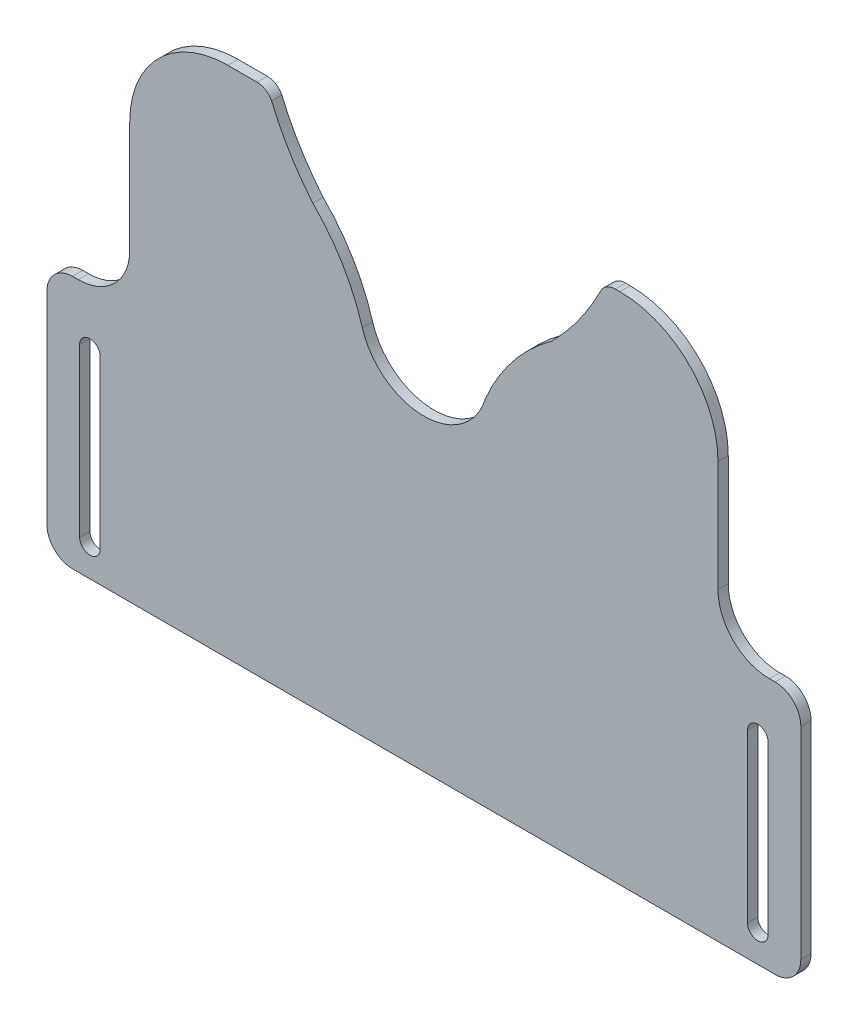
ISO-10303-21;
HEADER;
FILE_DESCRIPTION(('STEP AP214'),'2;1');
FILE_NAME('part.step','',(''),(''),'','','');
FILE_SCHEMA(('AUTOMOTIVE_DESIGN { 1 0 10303 214 1 1 1 1 }'));
ENDSEC;
DATA;
#1=APPLICATION_CONTEXT('core data for automotive mechanical design processes');
#2=APPLICATION_PROTOCOL_DEFINITION('international standard','automotive_design',2000,#1);
#3=PRODUCT_CONTEXT('',#1,'mechanical');
#4=PRODUCT('Part','Part','',(#3));
#5=PRODUCT_RELATED_PRODUCT_CATEGORY('part','',(#4));
#6=PRODUCT_DEFINITION_FORMATION('','',#4);
#7=PRODUCT_DEFINITION_CONTEXT('part definition',#1,'design');
#8=PRODUCT_DEFINITION('design','',#6,#7);
#9=PRODUCT_DEFINITION_SHAPE('','',#8);
#10=(LENGTH_UNIT() NAMED_UNIT(*) SI_UNIT(.MILLI.,.METRE.));
#11=(NAMED_UNIT(*) PLANE_ANGLE_UNIT() SI_UNIT($,.RADIAN.));
#12=(NAMED_UNIT(*) SI_UNIT($,.STERADIAN.) SOLID_ANGLE_UNIT());
#13=UNCERTAINTY_MEASURE_WITH_UNIT(LENGTH_MEASURE(1.E-05),#10,'distance_accuracy_value','');
#14=(GEOMETRIC_REPRESENTATION_CONTEXT(3) GLOBAL_UNCERTAINTY_ASSIGNED_CONTEXT((#13)) GLOBAL_UNIT_ASSIGNED_CONTEXT((#10,
#11,#12)) REPRESENTATION_CONTEXT('',''));
#15=CARTESIAN_POINT('',(0.,0.,0.));
#16=DIRECTION('',(0.,0.,1.));
#17=DIRECTION('',(1.,0.,0.));
#18=AXIS2_PLACEMENT_3D('',#15,#16,#17);
#19=CARTESIAN_POINT('',(76.3333289832106,155.198889476935,4.));
#20=DIRECTION('',(0.,0.,-1.));
#21=DIRECTION('',(-1.,0.,0.));
#22=AXIS2_PLACEMENT_3D('',#19,#20,#21);
#23=CYLINDRICAL_SURFACE('',#22,38.1666666666667);
#24=CARTESIAN_POINT('',(76.3333289832106,155.198889476935,0.));
#25=DIRECTION('',(0.,0.,1.));
#26=DIRECTION('',(1.,0.,0.));
#27=AXIS2_PLACEMENT_3D('',#24,#25,#26);
#28=CIRCLE('',#27,38.1666666666667);
#29=CARTESIAN_POINT('',(114.499995649877,155.198890546497,0.));
#30=VERTEX_POINT('',#29);
#31=CARTESIAN_POINT('',(76.3333272525749,193.365556143602,0.));
#32=VERTEX_POINT('',#31);
#33=EDGE_CURVE('E381',#30,#32,#28,.T.);
#34=ORIENTED_EDGE('',*,*,#33,.T.);
#35=DIRECTION('',(0.,0.,-1.));
#36=VECTOR('',#35,1.);
#37=CARTESIAN_POINT('',(76.3333272525749,193.365556143602,4.));
#38=LINE('',#37,#36);
#39=CARTESIAN_POINT('',(76.3333272525749,193.365556143602,4.));
#40=VERTEX_POINT('',#39);
#41=EDGE_CURVE('E468',#40,#32,#38,.T.);
#42=ORIENTED_EDGE('',*,*,#41,.F.);
#43=CARTESIAN_POINT('',(76.3333289832106,155.198889476935,4.));
#44=DIRECTION('',(0.,0.,1.));
#45=DIRECTION('',(1.,0.,0.));
#46=AXIS2_PLACEMENT_3D('',#43,#44,#45);
#47=CIRCLE('',#46,38.1666666666667);
#48=CARTESIAN_POINT('',(114.499995649877,155.198890546497,4.));
#49=VERTEX_POINT('',#48);
#50=EDGE_CURVE('E546',#49,#40,#47,.T.);
#51=ORIENTED_EDGE('',*,*,#50,.F.);
#52=DIRECTION('',(0.,0.,-1.));
#53=VECTOR('',#52,1.);
#54=CARTESIAN_POINT('',(114.499995649877,155.198890546497,4.));
#55=LINE('',#54,#53);
#56=EDGE_CURVE('E372',#49,#30,#55,.T.);
#57=ORIENTED_EDGE('',*,*,#56,.T.);
#58=EDGE_LOOP('',(#34,#42,#51,#57));
#59=FACE_BOUND('',#58,.T.);
#60=ADVANCED_FACE('F39',(#59),#23,.T.);
#61=CARTESIAN_POINT('',(76.3333272525749,193.365556143602,4.));
#62=DIRECTION('',(0.,-1.,0.));
#63=DIRECTION('',(0.,0.,-1.));
#64=AXIS2_PLACEMENT_3D('',#61,#62,#63);
#65=PLANE('',#64);
#66=DIRECTION('',(-1.,0.,0.));
#67=VECTOR('',#66,1.);
#68=CARTESIAN_POINT('',(76.3333272525749,193.365556143602,0.));
#69=LINE('',#68,#67);
#70=CARTESIAN_POINT('',(74.5052506463805,193.365556143602,0.));
#71=VERTEX_POINT('',#70);
#72=EDGE_CURVE('E385',#32,#71,#69,.T.);
#73=ORIENTED_EDGE('',*,*,#72,.T.);
#74=DIRECTION('',(0.,0.,-1.));
#75=VECTOR('',#74,1.);
#76=CARTESIAN_POINT('',(74.5052506463805,193.365556143602,4.));
#77=LINE('',#76,#75);
#78=CARTESIAN_POINT('',(74.5052506463805,193.365556143602,4.));
#79=VERTEX_POINT('',#78);
#80=EDGE_CURVE('E464',#79,#71,#77,.T.);
#81=ORIENTED_EDGE('',*,*,#80,.F.);
#82=DIRECTION('',(-1.,0.,0.));
#83=VECTOR('',#82,1.);
#84=CARTESIAN_POINT('',(76.3333272525749,193.365556143602,4.));
#85=LINE('',#84,#83);
#86=EDGE_CURVE('E550',#40,#79,#85,.T.);
#87=ORIENTED_EDGE('',*,*,#86,.F.);
#88=ORIENTED_EDGE('',*,*,#41,.T.);
#89=EDGE_LOOP('',(#73,#81,#87,#88));
#90=FACE_BOUND('',#89,.T.);
#91=ADVANCED_FACE('F671',(#90),#65,.F.);
#92=CARTESIAN_POINT('',(74.5052506463805,187.004445032491,4.));
#93=DIRECTION('',(0.,0.,-1.));
#94=DIRECTION('',(-1.,0.,0.));
#95=AXIS2_PLACEMENT_3D('',#92,#93,#94);
#96=CYLINDRICAL_SURFACE('',#95,6.36111111111113);
#97=CARTESIAN_POINT('',(74.5052506463805,187.004445032491,0.));
#98=DIRECTION('',(0.,0.,1.));
#99=DIRECTION('',(1.,0.,0.));
#100=AXIS2_PLACEMENT_3D('',#97,#98,#99);
#101=CIRCLE('',#100,6.36111111111113);
#102=CARTESIAN_POINT('',(68.8157016929044,189.849223982409,0.));
#103=VERTEX_POINT('',#102);
#104=EDGE_CURVE('E389',#71,#103,#101,.T.);
#105=ORIENTED_EDGE('',*,*,#104,.T.);
#106=DIRECTION('',(0.,0.,-1.));
#107=VECTOR('',#106,1.);
#108=CARTESIAN_POINT('',(68.8157016929044,189.849223982409,4.));
#109=LINE('',#108,#107);
#110=CARTESIAN_POINT('',(68.8157016929044,189.849223982409,4.));
#111=VERTEX_POINT('',#110);
#112=EDGE_CURVE('E460',#111,#103,#109,.T.);
#113=ORIENTED_EDGE('',*,*,#112,.F.);
#114=CARTESIAN_POINT('',(74.5052506463805,187.004445032491,4.));
#115=DIRECTION('',(0.,0.,1.));
#116=DIRECTION('',(1.,0.,0.));
#117=AXIS2_PLACEMENT_3D('',#114,#115,#116);
#118=CIRCLE('',#117,6.36111111111113);
#119=EDGE_CURVE('E553',#79,#111,#118,.T.);
#120=ORIENTED_EDGE('',*,*,#119,.F.);
#121=ORIENTED_EDGE('',*,*,#80,.T.);
#122=EDGE_LOOP('',(#105,#113,#120,#121));
#123=FACE_BOUND('',#122,.T.);
#124=ADVANCED_FACE('F677',(#123),#96,.T.);
#125=CARTESIAN_POINT('',(-22.2170815627129,235.365687181111,4.));
#126=DIRECTION('',(0.,0.,-1.));
#127=DIRECTION('',(-1.,0.,0.));
#128=AXIS2_PLACEMENT_3D('',#125,#126,#127);
#129=CYLINDRICAL_SURFACE('',#128,101.777777777779);
#130=CARTESIAN_POINT('',(-22.2170815627129,235.365687181111,0.));
#131=DIRECTION('',(0.,0.,-1.));
#132=DIRECTION('',(1.,0.,0.));
#133=AXIS2_PLACEMENT_3D('',#130,#131,#132);
#134=CIRCLE('',#133,101.777777777779);
#135=CARTESIAN_POINT('',(49.7506752780528,163.397930340347,0.));
#136=VERTEX_POINT('',#135);
#137=EDGE_CURVE('E392',#103,#136,#134,.T.);
#138=ORIENTED_EDGE('',*,*,#137,.T.);
#139=DIRECTION('',(0.,0.,-1.));
#140=VECTOR('',#139,1.);
#141=CARTESIAN_POINT('',(49.7506752780528,163.397930340347,4.));
#142=LINE('',#141,#140);
#143=CARTESIAN_POINT('',(49.7506752780528,163.397930340347,4.));
#144=VERTEX_POINT('',#143);
#145=EDGE_CURVE('E456',#144,#136,#142,.T.);
#146=ORIENTED_EDGE('',*,*,#145,.F.);
#147=CARTESIAN_POINT('',(-22.2170815627129,235.365687181111,4.));
#148=DIRECTION('',(0.,0.,-1.));
#149=DIRECTION('',(1.,0.,0.));
#150=AXIS2_PLACEMENT_3D('',#147,#148,#149);
#151=CIRCLE('',#150,101.777777777779);
#152=EDGE_CURVE('E556',#111,#144,#151,.T.);
#153=ORIENTED_EDGE('',*,*,#152,.F.);
#154=ORIENTED_EDGE('',*,*,#112,.T.);
#155=EDGE_LOOP('',(#138,#146,#153,#154));
#156=FACE_BOUND('',#155,.T.);
#157=ADVANCED_FACE('F712',(#156),#129,.F.);
#158=CARTESIAN_POINT('',(94.2687294725971,101.390506361363,4.));
#159=DIRECTION('',(0.,0.,-1.));
#160=DIRECTION('',(-1.,0.,0.));
#161=AXIS2_PLACEMENT_3D('',#158,#159,#160);
#162=CYLINDRICAL_SURFACE('',#161,76.3333333333336);
#163=CARTESIAN_POINT('',(94.2687294725971,101.390506361363,0.));
#164=DIRECTION('',(0.,0.,1.));
#165=DIRECTION('',(1.,0.,0.));
#166=AXIS2_PLACEMENT_3D('',#163,#164,#165);
#167=CIRCLE('',#166,76.3333333333336);
#168=CARTESIAN_POINT('',(23.967616463288,131.131577078978,0.));
#169=VERTEX_POINT('',#168);
#170=EDGE_CURVE('E395',#136,#169,#167,.T.);
#171=ORIENTED_EDGE('',*,*,#170,.T.);
#172=DIRECTION('',(0.,0.,-1.));
#173=VECTOR('',#172,1.);
#174=CARTESIAN_POINT('',(23.967616463288,131.131577078978,4.));
#175=LINE('',#174,#173);
#176=CARTESIAN_POINT('',(23.967616463288,131.131577078978,4.));
#177=VERTEX_POINT('',#176);
#178=EDGE_CURVE('E452',#177,#169,#175,.T.);
#179=ORIENTED_EDGE('',*,*,#178,.F.);
#180=CARTESIAN_POINT('',(94.2687294725971,101.390506361363,4.));
#181=DIRECTION('',(0.,0.,1.));
#182=DIRECTION('',(1.,0.,0.));
#183=AXIS2_PLACEMENT_3D('',#180,#181,#182);
#184=CIRCLE('',#183,76.3333333333336);
#185=EDGE_CURVE('E559',#144,#177,#184,.T.);
#186=ORIENTED_EDGE('',*,*,#185,.F.);
#187=ORIENTED_EDGE('',*,*,#145,.T.);
#188=EDGE_LOOP('',(#171,#179,#186,#187));
#189=FACE_BOUND('',#188,.T.);
#190=ADVANCED_FACE('F718',(#189),#162,.T.);
#191=CARTESIAN_POINT('',(-1.21616577122813E-06,138.241661661564,4.));
#192=DIRECTION('',(0.,0.,-1.));
#193=DIRECTION('',(-1.,0.,0.));
#194=AXIS2_PLACEMENT_3D('',#191,#192,#193);
#195=CYLINDRICAL_SURFACE('',#194,25.);
#196=CARTESIAN_POINT('',(-1.21616577122813E-06,138.241661661564,0.));
#197=DIRECTION('',(0.,0.,-1.));
#198=DIRECTION('',(1.,0.,0.));
#199=AXIS2_PLACEMENT_3D('',#196,#197,#198);
#200=CIRCLE('',#199,25.);
#201=CARTESIAN_POINT('',(-23.9676183692534,131.131575304633,0.));
#202=VERTEX_POINT('',#201);
#203=EDGE_CURVE('E398',#169,#202,#200,.T.);
#204=ORIENTED_EDGE('',*,*,#203,.T.);
#205=DIRECTION('',(0.,0.,-1.));
#206=VECTOR('',#205,1.);
#207=CARTESIAN_POINT('',(-23.9676183692534,131.131575304633,4.));
#208=LINE('',#207,#206);
#209=CARTESIAN_POINT('',(-23.9676183692534,131.131575304633,4.));
#210=VERTEX_POINT('',#209);
#211=EDGE_CURVE('E448',#210,#202,#208,.T.);
#212=ORIENTED_EDGE('',*,*,#211,.F.);
#213=CARTESIAN_POINT('',(-1.21616577122813E-06,138.241661661564,4.));
#214=DIRECTION('',(0.,0.,-1.));
#215=DIRECTION('',(1.,0.,0.));
#216=AXIS2_PLACEMENT_3D('',#213,#214,#215);
#217=CIRCLE('',#216,25.);
#218=EDGE_CURVE('E562',#177,#210,#217,.T.);
#219=ORIENTED_EDGE('',*,*,#218,.F.);
#220=ORIENTED_EDGE('',*,*,#178,.T.);
#221=EDGE_LOOP('',(#204,#212,#219,#220));
#222=FACE_BOUND('',#221,.T.);
#223=ADVANCED_FACE('F722',(#222),#195,.F.);
#224=CARTESIAN_POINT('',(-97.1487427433478,109.422111628136,4.));
#225=DIRECTION('',(0.,0.,-1.));
#226=DIRECTION('',(-1.,0.,0.));
#227=AXIS2_PLACEMENT_3D('',#224,#225,#226);
#228=CYLINDRICAL_SURFACE('',#227,76.3333333333336);
#229=CARTESIAN_POINT('',(-97.1487427433478,109.422111628136,0.));
#230=DIRECTION('',(0.,0.,1.));
#231=DIRECTION('',(1.,0.,0.));
#232=AXIS2_PLACEMENT_3D('',#229,#230,#231);
#233=CIRCLE('',#232,76.3333333333336);
#234=CARTESIAN_POINT('',(-43.1729271107142,163.397931256649,0.));
#235=VERTEX_POINT('',#234);
#236=EDGE_CURVE('E401',#202,#235,#233,.T.);
#237=ORIENTED_EDGE('',*,*,#236,.T.);
#238=DIRECTION('',(0.,0.,-1.));
#239=VECTOR('',#238,1.);
#240=CARTESIAN_POINT('',(-43.1729271107142,163.397931256649,4.));
#241=LINE('',#240,#239);
#242=CARTESIAN_POINT('',(-43.1729271107142,163.397931256649,4.));
#243=VERTEX_POINT('',#242);
#244=EDGE_CURVE('E444',#243,#235,#241,.T.);
#245=ORIENTED_EDGE('',*,*,#244,.F.);
#246=CARTESIAN_POINT('',(-97.1487427433478,109.422111628136,4.));
#247=DIRECTION('',(0.,0.,1.));
#248=DIRECTION('',(1.,0.,0.));
#249=AXIS2_PLACEMENT_3D('',#246,#247,#248);
#250=CIRCLE('',#249,76.3333333333336);
#251=EDGE_CURVE('E565',#210,#243,#250,.T.);
#252=ORIENTED_EDGE('',*,*,#251,.F.);
#253=ORIENTED_EDGE('',*,*,#211,.T.);
#254=EDGE_LOOP('',(#237,#245,#252,#253));
#255=FACE_BOUND('',#254,.T.);
#256=ADVANCED_FACE('F727',(#255),#228,.T.);
#257=CARTESIAN_POINT('',(34.7025770998733,228.927481028713,4.));
#258=DIRECTION('',(0.,0.,-1.));
#259=DIRECTION('',(-1.,0.,0.));
#260=AXIS2_PLACEMENT_3D('',#257,#258,#259);
#261=CYLINDRICAL_SURFACE('',#260,101.777777777777);
#262=CARTESIAN_POINT('',(34.7025770998733,228.927481028713,0.));
#263=DIRECTION('',(0.,0.,-1.));
#264=DIRECTION('',(1.,0.,0.));
#265=AXIS2_PLACEMENT_3D('',#262,#263,#264);
#266=CIRCLE('',#265,101.777777777777);
#267=CARTESIAN_POINT('',(-59.2740470790445,189.849224193011,0.));
#268=VERTEX_POINT('',#267);
#269=EDGE_CURVE('E404',#235,#268,#266,.T.);
#270=ORIENTED_EDGE('',*,*,#269,.T.);
#271=DIRECTION('',(0.,0.,-1.));
#272=VECTOR('',#271,1.);
#273=CARTESIAN_POINT('',(-59.2740470790445,189.849224193011,4.));
#274=LINE('',#273,#272);
#275=CARTESIAN_POINT('',(-59.2740470790445,189.849224193011,4.));
#276=VERTEX_POINT('',#275);
#277=EDGE_CURVE('E440',#276,#268,#274,.T.);
#278=ORIENTED_EDGE('',*,*,#277,.F.);
#279=CARTESIAN_POINT('',(34.7025770998733,228.927481028713,4.));
#280=DIRECTION('',(0.,0.,-1.));
#281=DIRECTION('',(1.,0.,0.));
#282=AXIS2_PLACEMENT_3D('',#279,#280,#281);
#283=CIRCLE('',#282,101.777777777777);
#284=EDGE_CURVE('E568',#243,#276,#283,.T.);
#285=ORIENTED_EDGE('',*,*,#284,.F.);
#286=ORIENTED_EDGE('',*,*,#244,.T.);
#287=EDGE_LOOP('',(#270,#278,#285,#286));
#288=FACE_BOUND('',#287,.T.);
#289=ADVANCED_FACE('F733',(#288),#261,.F.);
#290=CARTESIAN_POINT('',(-64.9635959272196,187.004445032491,4.));
#291=DIRECTION('',(0.,0.,-1.));
#292=DIRECTION('',(-1.,0.,0.));
#293=AXIS2_PLACEMENT_3D('',#290,#291,#292);
#294=CYLINDRICAL_SURFACE('',#293,6.36111111111103);
#295=CARTESIAN_POINT('',(-64.9635959272196,187.004445032491,0.));
#296=DIRECTION('',(0.,0.,1.));
#297=DIRECTION('',(1.,0.,0.));
#298=AXIS2_PLACEMENT_3D('',#295,#296,#297);
#299=CIRCLE('',#298,6.36111111111103);
#300=CARTESIAN_POINT('',(-64.9635959272196,193.365556143602,0.));
#301=VERTEX_POINT('',#300);
#302=EDGE_CURVE('E407',#268,#301,#299,.T.);
#303=ORIENTED_EDGE('',*,*,#302,.T.);
#304=DIRECTION('',(0.,0.,-1.));
#305=VECTOR('',#304,1.);
#306=CARTESIAN_POINT('',(-64.9635959272196,193.365556143602,4.));
#307=LINE('',#306,#305);
#308=CARTESIAN_POINT('',(-64.9635959272196,193.365556143602,4.));
#309=VERTEX_POINT('',#308);
#310=EDGE_CURVE('E436',#309,#301,#307,.T.);
#311=ORIENTED_EDGE('',*,*,#310,.F.);
#312=CARTESIAN_POINT('',(-64.9635959272196,187.004445032491,4.));
#313=DIRECTION('',(0.,0.,1.));
#314=DIRECTION('',(1.,0.,0.));
#315=AXIS2_PLACEMENT_3D('',#312,#313,#314);
#316=CIRCLE('',#315,6.36111111111103);
#317=EDGE_CURVE('E571',#276,#309,#316,.T.);
#318=ORIENTED_EDGE('',*,*,#317,.F.);
#319=ORIENTED_EDGE('',*,*,#277,.T.);
#320=EDGE_LOOP('',(#303,#311,#318,#319));
#321=FACE_BOUND('',#320,.T.);
#322=ADVANCED_FACE('F737',(#321),#294,.T.);
#323=CARTESIAN_POINT('',(-64.9635959272196,193.365556143602,4.));
#324=DIRECTION('',(0.,-1.,0.));
#325=DIRECTION('',(0.,0.,-1.));
#326=AXIS2_PLACEMENT_3D('',#323,#324,#325);
#327=PLANE('',#326);
#328=DIRECTION('',(-1.,0.,0.));
#329=VECTOR('',#328,1.);
#330=CARTESIAN_POINT('',(-64.9635959272196,193.365556143602,0.));
#331=LINE('',#330,#329);
#332=CARTESIAN_POINT('',(-76.3333380227836,193.365556143602,0.));
#333=VERTEX_POINT('',#332);
#334=EDGE_CURVE('E410',#301,#333,#331,.T.);
#335=ORIENTED_EDGE('',*,*,#334,.T.);
#336=DIRECTION('',(0.,0.,-1.));
#337=VECTOR('',#336,1.);
#338=CARTESIAN_POINT('',(-76.3333380227836,193.365556143602,4.));
#339=LINE('',#338,#337);
#340=CARTESIAN_POINT('',(-76.3333380227836,193.365556143602,4.));
#341=VERTEX_POINT('',#340);
#342=EDGE_CURVE('E432',#341,#333,#339,.T.);
#343=ORIENTED_EDGE('',*,*,#342,.F.);
#344=DIRECTION('',(-1.,0.,0.));
#345=VECTOR('',#344,1.);
#346=CARTESIAN_POINT('',(-64.9635959272196,193.365556143602,4.));
#347=LINE('',#346,#345);
#348=EDGE_CURVE('E574',#309,#341,#347,.T.);
#349=ORIENTED_EDGE('',*,*,#348,.F.);
#350=ORIENTED_EDGE('',*,*,#310,.T.);
#351=EDGE_LOOP('',(#335,#343,#349,#350));
#352=FACE_BOUND('',#351,.T.);
#353=ADVANCED_FACE('F742',(#352),#327,.F.);
#354=CARTESIAN_POINT('',(-76.3333376881644,155.198889476935,4.));
#355=DIRECTION('',(0.,0.,-1.));
#356=DIRECTION('',(-1.,0.,0.));
#357=AXIS2_PLACEMENT_3D('',#354,#355,#356);
#358=CYLINDRICAL_SURFACE('',#357,38.1666666666666);
#359=CARTESIAN_POINT('',(-76.3333376881644,155.198889476935,0.));
#360=DIRECTION('',(0.,0.,1.));
#361=DIRECTION('',(1.,0.,0.));
#362=AXIS2_PLACEMENT_3D('',#359,#360,#361);
#363=CIRCLE('',#362,38.1666666666666);
#364=CARTESIAN_POINT('',(-114.500004354831,155.198888405766,0.));
#365=VERTEX_POINT('',#364);
#366=EDGE_CURVE('E413',#333,#365,#363,.T.);
#367=ORIENTED_EDGE('',*,*,#366,.T.);
#368=DIRECTION('',(0.,0.,-1.));
#369=VECTOR('',#368,1.);
#370=CARTESIAN_POINT('',(-114.500004354831,155.198888405766,4.));
#371=LINE('',#370,#369);
#372=CARTESIAN_POINT('',(-114.500004354831,155.198888405766,4.));
#373=VERTEX_POINT('',#372);
#374=EDGE_CURVE('E428',#373,#365,#371,.T.);
#375=ORIENTED_EDGE('',*,*,#374,.F.);
#376=CARTESIAN_POINT('',(-76.3333376881644,155.198889476935,4.));
#377=DIRECTION('',(0.,0.,1.));
#378=DIRECTION('',(1.,0.,0.));
#379=AXIS2_PLACEMENT_3D('',#376,#377,#378);
#380=CIRCLE('',#379,38.1666666666666);
#381=EDGE_CURVE('E577',#341,#373,#380,.T.);
#382=ORIENTED_EDGE('',*,*,#381,.F.);
#383=ORIENTED_EDGE('',*,*,#342,.T.);
#384=EDGE_LOOP('',(#367,#375,#382,#383));
#385=FACE_BOUND('',#384,.T.);
#386=ADVANCED_FACE('F746',(#385),#358,.T.);
#387=CARTESIAN_POINT('',(-114.500004354831,155.198888405766,4.));
#388=DIRECTION('',(1.,0.,0.));
#389=DIRECTION('',(0.,1.,0.));
#390=AXIS2_PLACEMENT_3D('',#387,#388,#389);
#391=PLANE('',#390);
#392=DIRECTION('',(0.,-1.,0.));
#393=VECTOR('',#392,1.);
#394=CARTESIAN_POINT('',(-114.500004354831,155.198888405766,0.));
#395=LINE('',#394,#393);
#396=CARTESIAN_POINT('',(-114.500004354831,112.,0.));
#397=VERTEX_POINT('',#396);
#398=EDGE_CURVE('E416',#365,#397,#395,.T.);
#399=ORIENTED_EDGE('',*,*,#398,.T.);
#400=DIRECTION('',(0.,0.,1.));
#401=VECTOR('',#400,1.);
#402=CARTESIAN_POINT('',(-114.500004354831,112.,4.));
#403=LINE('',#402,#401);
#404=CARTESIAN_POINT('',(-114.500004354831,112.,4.));
#405=VERTEX_POINT('',#404);
#406=EDGE_CURVE('E357',#397,#405,#403,.T.);
#407=ORIENTED_EDGE('',*,*,#406,.T.);
#408=DIRECTION('',(0.,-1.,0.));
#409=VECTOR('',#408,1.);
#410=CARTESIAN_POINT('',(-114.500004354831,155.198888405766,4.));
#411=LINE('',#410,#409);
#412=EDGE_CURVE('E579',#373,#405,#411,.T.);
#413=ORIENTED_EDGE('',*,*,#412,.F.);
#414=ORIENTED_EDGE('',*,*,#374,.T.);
#415=EDGE_LOOP('',(#399,#407,#413,#414));
#416=FACE_BOUND('',#415,.T.);
#417=ADVANCED_FACE('F749',(#416),#391,.F.);
#418=CARTESIAN_POINT('',(-114.500004354831,-6.63444385639828,4.));
#419=DIRECTION('',(0.,1.,0.));
#420=DIRECTION('',(-1.,0.,0.));
#421=AXIS2_PLACEMENT_3D('',#418,#419,#420);
#422=PLANE('',#421);
#423=DIRECTION('',(1.,0.,0.));
#424=VECTOR('',#423,1.);
#425=CARTESIAN_POINT('',(-114.500004354831,-6.63444385639828,0.));
#426=LINE('',#425,#424);
#427=CARTESIAN_POINT('',(-136.747353152999,-6.63444385639828,0.));
#428=VERTEX_POINT('',#427);
#429=CARTESIAN_POINT('',(136.747353152999,-6.63444385639826,0.));
#430=VERTEX_POINT('',#429);
#431=EDGE_CURVE('E420',#428,#430,#426,.T.);
#432=ORIENTED_EDGE('',*,*,#431,.T.);
#433=DIRECTION('',(0.,0.,1.));
#434=VECTOR('',#433,1.);
#435=CARTESIAN_POINT('',(136.747353152999,-6.63444385639826,4.));
#436=LINE('',#435,#434);
#437=CARTESIAN_POINT('',(136.747353152999,-6.63444385639826,4.));
#438=VERTEX_POINT('',#437);
#439=EDGE_CURVE('E342',#430,#438,#436,.T.);
#440=ORIENTED_EDGE('',*,*,#439,.T.);
#441=DIRECTION('',(1.,0.,0.));
#442=VECTOR('',#441,1.);
#443=CARTESIAN_POINT('',(-114.500004354831,-6.63444385639828,4.));
#444=LINE('',#443,#442);
#445=CARTESIAN_POINT('',(-136.747353152999,-6.63444385639828,4.));
#446=VERTEX_POINT('',#445);
#447=EDGE_CURVE('E373',#446,#438,#444,.T.);
#448=ORIENTED_EDGE('',*,*,#447,.F.);
#449=DIRECTION('',(0.,0.,1.));
#450=VECTOR('',#449,1.);
#451=CARTESIAN_POINT('',(-136.747353152999,-6.63444385639828,0.));
#452=LINE('',#451,#450);
#453=EDGE_CURVE('E339',#446,#428,#452,.F.);
#454=ORIENTED_EDGE('',*,*,#453,.T.);
#455=EDGE_LOOP('',(#432,#440,#448,#454));
#456=FACE_BOUND('',#455,.T.);
#457=ADVANCED_FACE('F518',(#456),#422,.F.);
#458=CARTESIAN_POINT('',(114.499995649877,-6.63444385639826,4.));
#459=DIRECTION('',(-1.,0.,0.));
#460=DIRECTION('',(0.,-1.,0.));
#461=AXIS2_PLACEMENT_3D('',#458,#459,#460);
#462=PLANE('',#461);
#463=DIRECTION('',(0.,1.,0.));
#464=VECTOR('',#463,1.);
#465=CARTESIAN_POINT('',(114.499995649877,-6.63444385639826,4.));
#466=LINE('',#465,#464);
#467=CARTESIAN_POINT('',(114.499995649877,112.,4.));
#468=VERTEX_POINT('',#467);
#469=EDGE_CURVE('E368',#468,#49,#466,.T.);
#470=ORIENTED_EDGE('',*,*,#469,.F.);
#471=DIRECTION('',(0.,0.,1.));
#472=VECTOR('',#471,1.);
#473=CARTESIAN_POINT('',(114.499995649877,112.,4.));
#474=LINE('',#473,#472);
#475=CARTESIAN_POINT('',(114.499995649877,112.,0.));
#476=VERTEX_POINT('',#475);
#477=EDGE_CURVE('E55',#468,#476,#474,.F.);
#478=ORIENTED_EDGE('',*,*,#477,.T.);
#479=DIRECTION('',(0.,1.,0.));
#480=VECTOR('',#479,1.);
#481=CARTESIAN_POINT('',(114.499995649877,-6.63444385639826,0.));
#482=LINE('',#481,#480);
#483=EDGE_CURVE('E374',#476,#30,#482,.T.);
#484=ORIENTED_EDGE('',*,*,#483,.T.);
#485=ORIENTED_EDGE('',*,*,#56,.F.);
#486=EDGE_LOOP('',(#470,#478,#484,#485));
#487=FACE_BOUND('',#486,.T.);
#488=ADVANCED_FACE('F700',(#487),#462,.F.);
#489=CARTESIAN_POINT('',(76.3333289832106,155.198889476935,4.));
#490=DIRECTION('',(0.,0.,1.));
#491=DIRECTION('',(1.,0.,0.));
#492=AXIS2_PLACEMENT_3D('',#489,#490,#491);
#493=PLANE('',#492);
#494=DIRECTION('',(0.,1.,0.));
#495=VECTOR('',#494,1.);
#496=CARTESIAN_POINT('',(146.747353152999,-6.63444385639828,4.));
#497=LINE('',#496,#495);
#498=CARTESIAN_POINT('',(146.747353152999,3.36555614360174,4.));
#499=VERTEX_POINT('',#498);
#500=CARTESIAN_POINT('',(146.747353152999,82.,4.));
#501=VERTEX_POINT('',#500);
#502=EDGE_CURVE('E308',#499,#501,#497,.T.);
#503=ORIENTED_EDGE('',*,*,#502,.T.);
#504=CARTESIAN_POINT('',(136.747353152999,82.,4.));
#505=DIRECTION('',(0.,0.,1.));
#506=DIRECTION('',(1.,0.,0.));
#507=AXIS2_PLACEMENT_3D('',#504,#505,#506);
#508=CIRCLE('',#507,10.);
#509=CARTESIAN_POINT('',(136.747353152999,92.,4.));
#510=VERTEX_POINT('',#509);
#511=EDGE_CURVE('E321',#501,#510,#508,.T.);
#512=ORIENTED_EDGE('',*,*,#511,.T.);
#513=DIRECTION('',(-1.,0.,0.));
#514=VECTOR('',#513,1.);
#515=CARTESIAN_POINT('',(146.747353152999,92.,4.));
#516=LINE('',#515,#514);
#517=CARTESIAN_POINT('',(134.499995649877,92.,4.));
#518=VERTEX_POINT('',#517);
#519=EDGE_CURVE('E296',#510,#518,#516,.T.);
#520=ORIENTED_EDGE('',*,*,#519,.T.);
#521=CARTESIAN_POINT('',(134.499995649877,112.,4.));
#522=DIRECTION('',(0.,0.,1.));
#523=DIRECTION('',(1.,0.,0.));
#524=AXIS2_PLACEMENT_3D('',#521,#522,#523);
#525=CIRCLE('',#524,20.);
#526=EDGE_CURVE('E48',#518,#468,#525,.F.);
#527=ORIENTED_EDGE('',*,*,#526,.T.);
#528=ORIENTED_EDGE('',*,*,#469,.T.);
#529=ORIENTED_EDGE('',*,*,#50,.T.);
#530=ORIENTED_EDGE('',*,*,#86,.T.);
#531=ORIENTED_EDGE('',*,*,#119,.T.);
#532=ORIENTED_EDGE('',*,*,#152,.T.);
#533=ORIENTED_EDGE('',*,*,#185,.T.);
#534=ORIENTED_EDGE('',*,*,#218,.T.);
#535=ORIENTED_EDGE('',*,*,#251,.T.);
#536=ORIENTED_EDGE('',*,*,#284,.T.);
#537=ORIENTED_EDGE('',*,*,#317,.T.);
#538=ORIENTED_EDGE('',*,*,#348,.T.);
#539=ORIENTED_EDGE('',*,*,#381,.T.);
#540=ORIENTED_EDGE('',*,*,#412,.T.);
#541=CARTESIAN_POINT('',(-134.500004354831,112.,4.));
#542=DIRECTION('',(0.,0.,1.));
#543=DIRECTION('',(1.,0.,0.));
#544=AXIS2_PLACEMENT_3D('',#541,#542,#543);
#545=CIRCLE('',#544,20.);
#546=CARTESIAN_POINT('',(-134.500004354831,92.,4.));
#547=VERTEX_POINT('',#546);
#548=EDGE_CURVE('E599',#405,#547,#545,.F.);
#549=ORIENTED_EDGE('',*,*,#548,.T.);
#550=DIRECTION('',(-1.,0.,0.));
#551=VECTOR('',#550,1.);
#552=CARTESIAN_POINT('',(-146.747353152999,92.,4.));
#553=LINE('',#552,#551);
#554=CARTESIAN_POINT('',(-136.747353152999,92.,4.));
#555=VERTEX_POINT('',#554);
#556=EDGE_CURVE('E540',#547,#555,#553,.T.);
#557=ORIENTED_EDGE('',*,*,#556,.T.);
#558=CARTESIAN_POINT('',(-136.747353152999,82.,4.));
#559=DIRECTION('',(0.,0.,1.));
#560=DIRECTION('',(1.,0.,0.));
#561=AXIS2_PLACEMENT_3D('',#558,#559,#560);
#562=CIRCLE('',#561,10.);
#563=CARTESIAN_POINT('',(-146.747353152999,82.,4.));
#564=VERTEX_POINT('',#563);
#565=EDGE_CURVE('E479',#555,#564,#562,.T.);
#566=ORIENTED_EDGE('',*,*,#565,.T.);
#567=DIRECTION('',(0.,-1.,0.));
#568=VECTOR('',#567,1.);
#569=CARTESIAN_POINT('',(-146.747353152999,-6.63444385639828,4.));
#570=LINE('',#569,#568);
#571=CARTESIAN_POINT('',(-146.747353152999,3.36555614360172,4.));
#572=VERTEX_POINT('',#571);
#573=EDGE_CURVE('E536',#564,#572,#570,.T.);
#574=ORIENTED_EDGE('',*,*,#573,.T.);
#575=CARTESIAN_POINT('',(-136.747353152999,3.36555614360172,4.));
#576=DIRECTION('',(0.,0.,1.));
#577=DIRECTION('',(1.,0.,0.));
#578=AXIS2_PLACEMENT_3D('',#575,#576,#577);
#579=CIRCLE('',#578,10.);
#580=EDGE_CURVE('E484',#572,#446,#579,.T.);
#581=ORIENTED_EDGE('',*,*,#580,.T.);
#582=ORIENTED_EDGE('',*,*,#447,.T.);
#583=CARTESIAN_POINT('',(136.747353152999,3.36555614360174,4.));
#584=DIRECTION('',(0.,0.,1.));
#585=DIRECTION('',(1.,0.,0.));
#586=AXIS2_PLACEMENT_3D('',#583,#584,#585);
#587=CIRCLE('',#586,10.);
#588=EDGE_CURVE('E486',#438,#499,#587,.T.);
#589=ORIENTED_EDGE('',*,*,#588,.T.);
#590=EDGE_LOOP('',(#503,#512,#520,#527,#528,#529,#530,#531,#532,#533,#534,#535,#536,#537,#538,
#539,#540,#549,#557,#566,#574,#581,#582,#589));
#591=FACE_BOUND('',#590,.T.);
#592=DIRECTION('',(0.,-1.,0.));
#593=VECTOR('',#592,1.);
#594=CARTESIAN_POINT('',(-133.999999998125,70.3655561436018,4.));
#595=LINE('',#594,#593);
#596=CARTESIAN_POINT('',(-133.999999998125,70.3655561436018,4.));
#597=VERTEX_POINT('',#596);
#598=CARTESIAN_POINT('',(-133.999999998125,5.36555614360175,4.));
#599=VERTEX_POINT('',#598);
#600=EDGE_CURVE('E627',#597,#599,#595,.T.);
#601=ORIENTED_EDGE('',*,*,#600,.F.);
#602=CARTESIAN_POINT('',(-129.999999998125,70.3655561436018,4.));
#603=DIRECTION('',(0.,0.,1.));
#604=DIRECTION('',(1.,0.,0.));
#605=AXIS2_PLACEMENT_3D('',#602,#603,#604);
#606=CIRCLE('',#605,4.);
#607=CARTESIAN_POINT('',(-125.999999998125,70.3655561436018,4.));
#608=VERTEX_POINT('',#607);
#609=EDGE_CURVE('E306',#608,#597,#606,.T.);
#610=ORIENTED_EDGE('',*,*,#609,.F.);
#611=DIRECTION('',(0.,1.,0.));
#612=VECTOR('',#611,1.);
#613=CARTESIAN_POINT('',(-125.999999998125,70.3655561436018,4.));
#614=LINE('',#613,#612);
#615=CARTESIAN_POINT('',(-125.999999998125,5.36555614360175,4.));
#616=VERTEX_POINT('',#615);
#617=EDGE_CURVE('E608',#616,#608,#614,.T.);
#618=ORIENTED_EDGE('',*,*,#617,.F.);
#619=CARTESIAN_POINT('',(-129.999999998125,5.36555614360175,4.));
#620=DIRECTION('',(0.,0.,1.));
#621=DIRECTION('',(1.,0.,0.));
#622=AXIS2_PLACEMENT_3D('',#619,#620,#621);
#623=CIRCLE('',#622,4.00000000000005);
#624=EDGE_CURVE('E617',#599,#616,#623,.T.);
#625=ORIENTED_EDGE('',*,*,#624,.F.);
#626=EDGE_LOOP('',(#601,#610,#618,#625));
#627=FACE_BOUND('',#626,.T.);
#628=DIRECTION('',(0.,-1.,0.));
#629=VECTOR('',#628,1.);
#630=CARTESIAN_POINT('',(125.999999998125,70.3655561436018,4.));
#631=LINE('',#630,#629);
#632=CARTESIAN_POINT('',(125.999999998125,70.3655561436018,4.));
#633=VERTEX_POINT('',#632);
#634=CARTESIAN_POINT('',(125.999999998125,5.36555614360175,4.));
#635=VERTEX_POINT('',#634);
#636=EDGE_CURVE('E287',#633,#635,#631,.T.);
#637=ORIENTED_EDGE('',*,*,#636,.F.);
#638=CARTESIAN_POINT('',(129.999999998125,70.3655561436018,4.));
#639=DIRECTION('',(0.,0.,1.));
#640=DIRECTION('',(-1.,0.,0.));
#641=AXIS2_PLACEMENT_3D('',#638,#639,#640);
#642=CIRCLE('',#641,4.);
#643=CARTESIAN_POINT('',(133.999999998125,70.3655561436018,4.));
#644=VERTEX_POINT('',#643);
#645=EDGE_CURVE('E254',#644,#633,#642,.T.);
#646=ORIENTED_EDGE('',*,*,#645,.F.);
#647=DIRECTION('',(0.,1.,0.));
#648=VECTOR('',#647,1.);
#649=CARTESIAN_POINT('',(133.999999998125,70.3655561436018,4.));
#650=LINE('',#649,#648);
#651=CARTESIAN_POINT('',(133.999999998125,5.36555614360175,4.));
#652=VERTEX_POINT('',#651);
#653=EDGE_CURVE('E274',#652,#644,#650,.T.);
#654=ORIENTED_EDGE('',*,*,#653,.F.);
#655=CARTESIAN_POINT('',(129.999999998125,5.36555614360175,4.));
#656=DIRECTION('',(0.,0.,1.));
#657=DIRECTION('',(-1.,0.,0.));
#658=AXIS2_PLACEMENT_3D('',#655,#656,#657);
#659=CIRCLE('',#658,4.00000000000005);
#660=EDGE_CURVE('E278',#635,#652,#659,.T.);
#661=ORIENTED_EDGE('',*,*,#660,.F.);
#662=EDGE_LOOP('',(#637,#646,#654,#661));
#663=FACE_BOUND('',#662,.T.);
#664=ADVANCED_FACE('F494',(#591,#627,#663),#493,.T.);
#665=CARTESIAN_POINT('',(76.3333289832106,155.198889476935,0.));
#666=DIRECTION('',(0.,0.,1.));
#667=DIRECTION('',(1.,0.,0.));
#668=AXIS2_PLACEMENT_3D('',#665,#666,#667);
#669=PLANE('',#668);
#670=DIRECTION('',(-1.,0.,0.));
#671=VECTOR('',#670,1.);
#672=CARTESIAN_POINT('',(146.747353152999,92.,0.));
#673=LINE('',#672,#671);
#674=CARTESIAN_POINT('',(136.747353152999,92.,0.));
#675=VERTEX_POINT('',#674);
#676=CARTESIAN_POINT('',(134.499995649877,92.,0.));
#677=VERTEX_POINT('',#676);
#678=EDGE_CURVE('E307',#675,#677,#673,.T.);
#679=ORIENTED_EDGE('',*,*,#678,.F.);
#680=CARTESIAN_POINT('',(136.747353152999,82.,0.));
#681=DIRECTION('',(0.,0.,1.));
#682=DIRECTION('',(1.,0.,0.));
#683=AXIS2_PLACEMENT_3D('',#680,#681,#682);
#684=CIRCLE('',#683,10.);
#685=CARTESIAN_POINT('',(146.747353152999,82.,0.));
#686=VERTEX_POINT('',#685);
#687=EDGE_CURVE('E336',#675,#686,#684,.F.);
#688=ORIENTED_EDGE('',*,*,#687,.T.);
#689=DIRECTION('',(0.,1.,0.));
#690=VECTOR('',#689,1.);
#691=CARTESIAN_POINT('',(146.747353152999,-6.63444385639828,0.));
#692=LINE('',#691,#690);
#693=CARTESIAN_POINT('',(146.747353152999,3.36555614360174,0.));
#694=VERTEX_POINT('',#693);
#695=EDGE_CURVE('E302',#694,#686,#692,.T.);
#696=ORIENTED_EDGE('',*,*,#695,.F.);
#697=CARTESIAN_POINT('',(136.747353152999,3.36555614360174,0.));
#698=DIRECTION('',(0.,0.,1.));
#699=DIRECTION('',(1.,0.,0.));
#700=AXIS2_PLACEMENT_3D('',#697,#698,#699);
#701=CIRCLE('',#700,10.);
#702=EDGE_CURVE('E333',#694,#430,#701,.F.);
#703=ORIENTED_EDGE('',*,*,#702,.T.);
#704=ORIENTED_EDGE('',*,*,#431,.F.);
#705=CARTESIAN_POINT('',(-136.747353152999,3.36555614360172,0.));
#706=DIRECTION('',(0.,0.,1.));
#707=DIRECTION('',(1.,0.,0.));
#708=AXIS2_PLACEMENT_3D('',#705,#706,#707);
#709=CIRCLE('',#708,10.);
#710=CARTESIAN_POINT('',(-146.747353152999,3.36555614360172,0.));
#711=VERTEX_POINT('',#710);
#712=EDGE_CURVE('E330',#428,#711,#709,.F.);
#713=ORIENTED_EDGE('',*,*,#712,.T.);
#714=DIRECTION('',(0.,-1.,0.));
#715=VECTOR('',#714,1.);
#716=CARTESIAN_POINT('',(-146.747353152999,-6.63444385639828,0.));
#717=LINE('',#716,#715);
#718=CARTESIAN_POINT('',(-146.747353152999,82.,0.));
#719=VERTEX_POINT('',#718);
#720=EDGE_CURVE('E386',#719,#711,#717,.T.);
#721=ORIENTED_EDGE('',*,*,#720,.F.);
#722=CARTESIAN_POINT('',(-136.747353152999,82.,0.));
#723=DIRECTION('',(0.,0.,1.));
#724=DIRECTION('',(1.,0.,0.));
#725=AXIS2_PLACEMENT_3D('',#722,#723,#724);
#726=CIRCLE('',#725,10.);
#727=CARTESIAN_POINT('',(-136.747353152999,92.,0.));
#728=VERTEX_POINT('',#727);
#729=EDGE_CURVE('E326',#719,#728,#726,.F.);
#730=ORIENTED_EDGE('',*,*,#729,.T.);
#731=DIRECTION('',(-1.,0.,0.));
#732=VECTOR('',#731,1.);
#733=CARTESIAN_POINT('',(-146.747353152999,92.,0.));
#734=LINE('',#733,#732);
#735=CARTESIAN_POINT('',(-134.500004354831,92.,0.));
#736=VERTEX_POINT('',#735);
#737=EDGE_CURVE('E533',#736,#728,#734,.T.);
#738=ORIENTED_EDGE('',*,*,#737,.F.);
#739=CARTESIAN_POINT('',(-134.500004354831,112.,0.));
#740=DIRECTION('',(0.,0.,1.));
#741=DIRECTION('',(1.,0.,0.));
#742=AXIS2_PLACEMENT_3D('',#739,#740,#741);
#743=CIRCLE('',#742,20.);
#744=EDGE_CURVE('E592',#736,#397,#743,.T.);
#745=ORIENTED_EDGE('',*,*,#744,.T.);
#746=ORIENTED_EDGE('',*,*,#398,.F.);
#747=ORIENTED_EDGE('',*,*,#366,.F.);
#748=ORIENTED_EDGE('',*,*,#334,.F.);
#749=ORIENTED_EDGE('',*,*,#302,.F.);
#750=ORIENTED_EDGE('',*,*,#269,.F.);
#751=ORIENTED_EDGE('',*,*,#236,.F.);
#752=ORIENTED_EDGE('',*,*,#203,.F.);
#753=ORIENTED_EDGE('',*,*,#170,.F.);
#754=ORIENTED_EDGE('',*,*,#137,.F.);
#755=ORIENTED_EDGE('',*,*,#104,.F.);
#756=ORIENTED_EDGE('',*,*,#72,.F.);
#757=ORIENTED_EDGE('',*,*,#33,.F.);
#758=ORIENTED_EDGE('',*,*,#483,.F.);
#759=CARTESIAN_POINT('',(134.499995649877,112.,0.));
#760=DIRECTION('',(0.,0.,1.));
#761=DIRECTION('',(1.,0.,0.));
#762=AXIS2_PLACEMENT_3D('',#759,#760,#761);
#763=CIRCLE('',#762,20.);
#764=EDGE_CURVE('E11',#476,#677,#763,.T.);
#765=ORIENTED_EDGE('',*,*,#764,.T.);
#766=EDGE_LOOP('',(#679,#688,#696,#703,#704,#713,#721,#730,#738,#745,#746,#747,#748,#749,#750,
#751,#752,#753,#754,#755,#756,#757,#758,#765));
#767=FACE_BOUND('',#766,.T.);
#768=CARTESIAN_POINT('',(-129.999999998125,70.3655561436018,0.));
#769=DIRECTION('',(0.,0.,1.));
#770=DIRECTION('',(1.,0.,0.));
#771=AXIS2_PLACEMENT_3D('',#768,#769,#770);
#772=CIRCLE('',#771,4.);
#773=CARTESIAN_POINT('',(-125.999999998125,70.3655561436018,0.));
#774=VERTEX_POINT('',#773);
#775=CARTESIAN_POINT('',(-133.999999998125,70.3655561436018,0.));
#776=VERTEX_POINT('',#775);
#777=EDGE_CURVE('E605',#774,#776,#772,.T.);
#778=ORIENTED_EDGE('',*,*,#777,.T.);
#779=DIRECTION('',(0.,-1.,0.));
#780=VECTOR('',#779,1.);
#781=CARTESIAN_POINT('',(-133.999999998125,70.3655561436018,0.));
#782=LINE('',#781,#780);
#783=CARTESIAN_POINT('',(-133.999999998125,5.36555614360175,0.));
#784=VERTEX_POINT('',#783);
#785=EDGE_CURVE('E607',#776,#784,#782,.T.);
#786=ORIENTED_EDGE('',*,*,#785,.T.);
#787=CARTESIAN_POINT('',(-129.999999998125,5.36555614360175,0.));
#788=DIRECTION('',(0.,0.,1.));
#789=DIRECTION('',(1.,0.,0.));
#790=AXIS2_PLACEMENT_3D('',#787,#788,#789);
#791=CIRCLE('',#790,4.00000000000005);
#792=CARTESIAN_POINT('',(-125.999999998125,5.36555614360175,0.));
#793=VERTEX_POINT('',#792);
#794=EDGE_CURVE('E613',#784,#793,#791,.T.);
#795=ORIENTED_EDGE('',*,*,#794,.T.);
#796=DIRECTION('',(0.,1.,0.));
#797=VECTOR('',#796,1.);
#798=CARTESIAN_POINT('',(-125.999999998125,70.3655561436018,0.));
#799=LINE('',#798,#797);
#800=EDGE_CURVE('E623',#793,#774,#799,.T.);
#801=ORIENTED_EDGE('',*,*,#800,.T.);
#802=EDGE_LOOP('',(#778,#786,#795,#801));
#803=FACE_BOUND('',#802,.T.);
#804=CARTESIAN_POINT('',(129.999999998125,70.3655561436018,0.));
#805=DIRECTION('',(0.,0.,1.));
#806=DIRECTION('',(-1.,0.,0.));
#807=AXIS2_PLACEMENT_3D('',#804,#805,#806);
#808=CIRCLE('',#807,4.);
#809=CARTESIAN_POINT('',(133.999999998125,70.3655561436018,0.));
#810=VERTEX_POINT('',#809);
#811=CARTESIAN_POINT('',(125.999999998125,70.3655561436018,0.));
#812=VERTEX_POINT('',#811);
#813=EDGE_CURVE('E251',#810,#812,#808,.T.);
#814=ORIENTED_EDGE('',*,*,#813,.T.);
#815=DIRECTION('',(0.,-1.,0.));
#816=VECTOR('',#815,1.);
#817=CARTESIAN_POINT('',(125.999999998125,70.3655561436018,0.));
#818=LINE('',#817,#816);
#819=CARTESIAN_POINT('',(125.999999998125,5.36555614360175,0.));
#820=VERTEX_POINT('',#819);
#821=EDGE_CURVE('E264',#812,#820,#818,.T.);
#822=ORIENTED_EDGE('',*,*,#821,.T.);
#823=CARTESIAN_POINT('',(129.999999998125,5.36555614360175,0.));
#824=DIRECTION('',(0.,0.,1.));
#825=DIRECTION('',(-1.,0.,0.));
#826=AXIS2_PLACEMENT_3D('',#823,#824,#825);
#827=CIRCLE('',#826,4.00000000000005);
#828=CARTESIAN_POINT('',(133.999999998125,5.36555614360175,0.));
#829=VERTEX_POINT('',#828);
#830=EDGE_CURVE('E269',#820,#829,#827,.T.);
#831=ORIENTED_EDGE('',*,*,#830,.T.);
#832=DIRECTION('',(0.,1.,0.));
#833=VECTOR('',#832,1.);
#834=CARTESIAN_POINT('',(133.999999998125,70.3655561436018,0.));
#835=LINE('',#834,#833);
#836=EDGE_CURVE('E260',#829,#810,#835,.T.);
#837=ORIENTED_EDGE('',*,*,#836,.T.);
#838=EDGE_LOOP('',(#814,#822,#831,#837));
#839=FACE_BOUND('',#838,.T.);
#840=ADVANCED_FACE('F271',(#767,#803,#839),#669,.F.);
#841=CARTESIAN_POINT('',(-146.747353152999,-6.63444385639828,0.));
#842=DIRECTION('',(-1.,0.,0.));
#843=DIRECTION('',(0.,0.,1.));
#844=AXIS2_PLACEMENT_3D('',#841,#842,#843);
#845=PLANE('',#844);
#846=ORIENTED_EDGE('',*,*,#720,.T.);
#847=DIRECTION('',(0.,0.,1.));
#848=VECTOR('',#847,1.);
#849=CARTESIAN_POINT('',(-146.747353152999,3.36555614360172,4.));
#850=LINE('',#849,#848);
#851=EDGE_CURVE('E349',#711,#572,#850,.T.);
#852=ORIENTED_EDGE('',*,*,#851,.T.);
#853=ORIENTED_EDGE('',*,*,#573,.F.);
#854=DIRECTION('',(0.,0.,1.));
#855=VECTOR('',#854,1.);
#856=CARTESIAN_POINT('',(-146.747353152999,82.,0.));
#857=LINE('',#856,#855);
#858=EDGE_CURVE('E346',#564,#719,#857,.F.);
#859=ORIENTED_EDGE('',*,*,#858,.T.);
#860=EDGE_LOOP('',(#846,#852,#853,#859));
#861=FACE_BOUND('',#860,.T.);
#862=ADVANCED_FACE('F528',(#861),#845,.T.);
#863=CARTESIAN_POINT('',(-146.747353152999,92.,0.));
#864=DIRECTION('',(0.,1.,0.));
#865=DIRECTION('',(0.,0.,1.));
#866=AXIS2_PLACEMENT_3D('',#863,#864,#865);
#867=PLANE('',#866);
#868=ORIENTED_EDGE('',*,*,#556,.F.);
#869=DIRECTION('',(0.,0.,1.));
#870=VECTOR('',#869,1.);
#871=CARTESIAN_POINT('',(-134.500004354831,92.,0.));
#872=LINE('',#871,#870);
#873=EDGE_CURVE('E361',#547,#736,#872,.F.);
#874=ORIENTED_EDGE('',*,*,#873,.T.);
#875=ORIENTED_EDGE('',*,*,#737,.T.);
#876=DIRECTION('',(0.,0.,1.));
#877=VECTOR('',#876,1.);
#878=CARTESIAN_POINT('',(-136.747353152999,92.,0.));
#879=LINE('',#878,#877);
#880=EDGE_CURVE('E353',#728,#555,#879,.T.);
#881=ORIENTED_EDGE('',*,*,#880,.T.);
#882=EDGE_LOOP('',(#868,#874,#875,#881));
#883=FACE_BOUND('',#882,.T.);
#884=ADVANCED_FACE('F660',(#883),#867,.T.);
#885=CARTESIAN_POINT('',(-129.999999998125,70.3655561436018,0.));
#886=DIRECTION('',(0.,0.,1.));
#887=DIRECTION('',(1.,0.,0.));
#888=AXIS2_PLACEMENT_3D('',#885,#886,#887);
#889=CYLINDRICAL_SURFACE('',#888,4.);
#890=ORIENTED_EDGE('',*,*,#609,.T.);
#891=DIRECTION('',(0.,0.,1.));
#892=VECTOR('',#891,1.);
#893=CARTESIAN_POINT('',(-133.999999998125,70.3655561436018,0.));
#894=LINE('',#893,#892);
#895=EDGE_CURVE('E625',#776,#597,#894,.T.);
#896=ORIENTED_EDGE('',*,*,#895,.F.);
#897=ORIENTED_EDGE('',*,*,#777,.F.);
#898=DIRECTION('',(0.,0.,1.));
#899=VECTOR('',#898,1.);
#900=CARTESIAN_POINT('',(-125.999999998125,70.3655561436018,0.));
#901=LINE('',#900,#899);
#902=EDGE_CURVE('E543',#774,#608,#901,.T.);
#903=ORIENTED_EDGE('',*,*,#902,.T.);
#904=EDGE_LOOP('',(#890,#896,#897,#903));
#905=FACE_BOUND('',#904,.T.);
#906=ADVANCED_FACE('F658',(#905),#889,.F.);
#907=CARTESIAN_POINT('',(-125.999999998125,70.3655561436018,0.));
#908=DIRECTION('',(1.,0.,0.));
#909=DIRECTION('',(0.,1.,0.));
#910=AXIS2_PLACEMENT_3D('',#907,#908,#909);
#911=PLANE('',#910);
#912=ORIENTED_EDGE('',*,*,#617,.T.);
#913=ORIENTED_EDGE('',*,*,#902,.F.);
#914=ORIENTED_EDGE('',*,*,#800,.F.);
#915=DIRECTION('',(0.,0.,1.));
#916=VECTOR('',#915,1.);
#917=CARTESIAN_POINT('',(-125.999999998125,5.36555614360175,0.));
#918=LINE('',#917,#916);
#919=EDGE_CURVE('E636',#793,#616,#918,.T.);
#920=ORIENTED_EDGE('',*,*,#919,.T.);
#921=EDGE_LOOP('',(#912,#913,#914,#920));
#922=FACE_BOUND('',#921,.T.);
#923=ADVANCED_FACE('F657',(#922),#911,.F.);
#924=CARTESIAN_POINT('',(-129.999999998125,5.36555614360175,0.));
#925=DIRECTION('',(0.,0.,1.));
#926=DIRECTION('',(1.,0.,0.));
#927=AXIS2_PLACEMENT_3D('',#924,#925,#926);
#928=CYLINDRICAL_SURFACE('',#927,4.00000000000005);
#929=ORIENTED_EDGE('',*,*,#624,.T.);
#930=ORIENTED_EDGE('',*,*,#919,.F.);
#931=ORIENTED_EDGE('',*,*,#794,.F.);
#932=DIRECTION('',(0.,0.,1.));
#933=VECTOR('',#932,1.);
#934=CARTESIAN_POINT('',(-133.999999998125,5.36555614360175,0.));
#935=LINE('',#934,#933);
#936=EDGE_CURVE('E639',#784,#599,#935,.T.);
#937=ORIENTED_EDGE('',*,*,#936,.T.);
#938=EDGE_LOOP('',(#929,#930,#931,#937));
#939=FACE_BOUND('',#938,.T.);
#940=ADVANCED_FACE('F654',(#939),#928,.F.);
#941=CARTESIAN_POINT('',(-133.999999998125,70.3655561436018,0.));
#942=DIRECTION('',(-1.,0.,0.));
#943=DIRECTION('',(0.,-1.,0.));
#944=AXIS2_PLACEMENT_3D('',#941,#942,#943);
#945=PLANE('',#944);
#946=ORIENTED_EDGE('',*,*,#600,.T.);
#947=ORIENTED_EDGE('',*,*,#936,.F.);
#948=ORIENTED_EDGE('',*,*,#785,.F.);
#949=ORIENTED_EDGE('',*,*,#895,.T.);
#950=EDGE_LOOP('',(#946,#947,#948,#949));
#951=FACE_BOUND('',#950,.T.);
#952=ADVANCED_FACE('F646',(#951),#945,.F.);
#953=CARTESIAN_POINT('',(146.747353152999,92.,0.));
#954=DIRECTION('',(0.,1.,0.));
#955=DIRECTION('',(0.,0.,1.));
#956=AXIS2_PLACEMENT_3D('',#953,#954,#955);
#957=PLANE('',#956);
#958=ORIENTED_EDGE('',*,*,#678,.T.);
#959=DIRECTION('',(0.,0.,1.));
#960=VECTOR('',#959,1.);
#961=CARTESIAN_POINT('',(134.499995649877,92.,0.));
#962=LINE('',#961,#960);
#963=EDGE_CURVE('E364',#677,#518,#962,.T.);
#964=ORIENTED_EDGE('',*,*,#963,.T.);
#965=ORIENTED_EDGE('',*,*,#519,.F.);
#966=DIRECTION('',(0.,0.,1.));
#967=VECTOR('',#966,1.);
#968=CARTESIAN_POINT('',(136.747353152999,92.,0.));
#969=LINE('',#968,#967);
#970=EDGE_CURVE('E323',#510,#675,#969,.F.);
#971=ORIENTED_EDGE('',*,*,#970,.T.);
#972=EDGE_LOOP('',(#958,#964,#965,#971));
#973=FACE_BOUND('',#972,.T.);
#974=ADVANCED_FACE('F500',(#973),#957,.T.);
#975=CARTESIAN_POINT('',(146.747353152999,-6.63444385639828,0.));
#976=DIRECTION('',(1.,0.,0.));
#977=DIRECTION('',(0.,0.,-1.));
#978=AXIS2_PLACEMENT_3D('',#975,#976,#977);
#979=PLANE('',#978);
#980=ORIENTED_EDGE('',*,*,#695,.T.);
#981=DIRECTION('',(0.,0.,1.));
#982=VECTOR('',#981,1.);
#983=CARTESIAN_POINT('',(146.747353152999,82.,0.));
#984=LINE('',#983,#982);
#985=EDGE_CURVE('E475',#686,#501,#984,.T.);
#986=ORIENTED_EDGE('',*,*,#985,.T.);
#987=ORIENTED_EDGE('',*,*,#502,.F.);
#988=DIRECTION('',(0.,0.,1.));
#989=VECTOR('',#988,1.);
#990=CARTESIAN_POINT('',(146.747353152999,3.36555614360174,0.));
#991=LINE('',#990,#989);
#992=EDGE_CURVE('E472',#499,#694,#991,.F.);
#993=ORIENTED_EDGE('',*,*,#992,.T.);
#994=EDGE_LOOP('',(#980,#986,#987,#993));
#995=FACE_BOUND('',#994,.T.);
#996=ADVANCED_FACE('F510',(#995),#979,.T.);
#997=CARTESIAN_POINT('',(129.999999998125,70.3655561436018,0.));
#998=DIRECTION('',(0.,0.,1.));
#999=DIRECTION('',(1.,0.,0.));
#1000=AXIS2_PLACEMENT_3D('',#997,#998,#999);
#1001=CYLINDRICAL_SURFACE('',#1000,4.);
#1002=ORIENTED_EDGE('',*,*,#645,.T.);
#1003=DIRECTION('',(0.,0.,1.));
#1004=VECTOR('',#1003,1.);
#1005=CARTESIAN_POINT('',(125.999999998125,70.3655561436018,0.));
#1006=LINE('',#1005,#1004);
#1007=EDGE_CURVE('E247',#812,#633,#1006,.T.);
#1008=ORIENTED_EDGE('',*,*,#1007,.F.);
#1009=ORIENTED_EDGE('',*,*,#813,.F.);
#1010=DIRECTION('',(0.,0.,1.));
#1011=VECTOR('',#1010,1.);
#1012=CARTESIAN_POINT('',(133.999999998125,70.3655561436018,0.));
#1013=LINE('',#1012,#1011);
#1014=EDGE_CURVE('E293',#810,#644,#1013,.T.);
#1015=ORIENTED_EDGE('',*,*,#1014,.T.);
#1016=EDGE_LOOP('',(#1002,#1008,#1009,#1015));
#1017=FACE_BOUND('',#1016,.T.);
#1018=ADVANCED_FACE('F249',(#1017),#1001,.F.);
#1019=CARTESIAN_POINT('',(133.999999998125,70.3655561436018,0.));
#1020=DIRECTION('',(1.,0.,0.));
#1021=DIRECTION('',(0.,1.,0.));
#1022=AXIS2_PLACEMENT_3D('',#1019,#1020,#1021);
#1023=PLANE('',#1022);
#1024=ORIENTED_EDGE('',*,*,#653,.T.);
#1025=ORIENTED_EDGE('',*,*,#1014,.F.);
#1026=ORIENTED_EDGE('',*,*,#836,.F.);
#1027=DIRECTION('',(0.,0.,1.));
#1028=VECTOR('',#1027,1.);
#1029=CARTESIAN_POINT('',(133.999999998125,5.36555614360175,0.));
#1030=LINE('',#1029,#1028);
#1031=EDGE_CURVE('E297',#829,#652,#1030,.T.);
#1032=ORIENTED_EDGE('',*,*,#1031,.T.);
#1033=EDGE_LOOP('',(#1024,#1025,#1026,#1032));
#1034=FACE_BOUND('',#1033,.T.);
#1035=ADVANCED_FACE('F887',(#1034),#1023,.F.);
#1036=CARTESIAN_POINT('',(129.999999998125,5.36555614360175,0.));
#1037=DIRECTION('',(0.,0.,1.));
#1038=DIRECTION('',(1.,0.,0.));
#1039=AXIS2_PLACEMENT_3D('',#1036,#1037,#1038);
#1040=CYLINDRICAL_SURFACE('',#1039,4.00000000000005);
#1041=ORIENTED_EDGE('',*,*,#660,.T.);
#1042=ORIENTED_EDGE('',*,*,#1031,.F.);
#1043=ORIENTED_EDGE('',*,*,#830,.F.);
#1044=DIRECTION('',(0.,0.,1.));
#1045=VECTOR('',#1044,1.);
#1046=CARTESIAN_POINT('',(125.999999998125,5.36555614360175,0.));
#1047=LINE('',#1046,#1045);
#1048=EDGE_CURVE('E259',#820,#635,#1047,.T.);
#1049=ORIENTED_EDGE('',*,*,#1048,.T.);
#1050=EDGE_LOOP('',(#1041,#1042,#1043,#1049));
#1051=FACE_BOUND('',#1050,.T.);
#1052=ADVANCED_FACE('F895',(#1051),#1040,.F.);
#1053=CARTESIAN_POINT('',(125.999999998125,70.3655561436018,0.));
#1054=DIRECTION('',(-1.,0.,0.));
#1055=DIRECTION('',(0.,-1.,0.));
#1056=AXIS2_PLACEMENT_3D('',#1053,#1054,#1055);
#1057=PLANE('',#1056);
#1058=ORIENTED_EDGE('',*,*,#636,.T.);
#1059=ORIENTED_EDGE('',*,*,#1048,.F.);
#1060=ORIENTED_EDGE('',*,*,#821,.F.);
#1061=ORIENTED_EDGE('',*,*,#1007,.T.);
#1062=EDGE_LOOP('',(#1058,#1059,#1060,#1061));
#1063=FACE_BOUND('',#1062,.T.);
#1064=ADVANCED_FACE('F265',(#1063),#1057,.F.);
#1065=CARTESIAN_POINT('',(136.747353152999,82.,0.));
#1066=DIRECTION('',(0.,0.,1.));
#1067=DIRECTION('',(1.,0.,0.));
#1068=AXIS2_PLACEMENT_3D('',#1065,#1066,#1067);
#1069=CYLINDRICAL_SURFACE('',#1068,10.);
#1070=ORIENTED_EDGE('',*,*,#687,.F.);
#1071=ORIENTED_EDGE('',*,*,#970,.F.);
#1072=ORIENTED_EDGE('',*,*,#511,.F.);
#1073=ORIENTED_EDGE('',*,*,#985,.F.);
#1074=EDGE_LOOP('',(#1070,#1071,#1072,#1073));
#1075=FACE_BOUND('',#1074,.T.);
#1076=ADVANCED_FACE('F504',(#1075),#1069,.T.);
#1077=CARTESIAN_POINT('',(136.747353152999,3.36555614360174,4.));
#1078=DIRECTION('',(0.,0.,-1.));
#1079=DIRECTION('',(-1.,0.,0.));
#1080=AXIS2_PLACEMENT_3D('',#1077,#1078,#1079);
#1081=CYLINDRICAL_SURFACE('',#1080,10.);
#1082=ORIENTED_EDGE('',*,*,#702,.F.);
#1083=ORIENTED_EDGE('',*,*,#992,.F.);
#1084=ORIENTED_EDGE('',*,*,#588,.F.);
#1085=ORIENTED_EDGE('',*,*,#439,.F.);
#1086=EDGE_LOOP('',(#1082,#1083,#1084,#1085));
#1087=FACE_BOUND('',#1086,.T.);
#1088=ADVANCED_FACE('F513',(#1087),#1081,.T.);
#1089=CARTESIAN_POINT('',(-136.747353152999,3.36555614360172,0.));
#1090=DIRECTION('',(0.,0.,-1.));
#1091=DIRECTION('',(-1.,0.,0.));
#1092=AXIS2_PLACEMENT_3D('',#1089,#1090,#1091);
#1093=CYLINDRICAL_SURFACE('',#1092,10.);
#1094=ORIENTED_EDGE('',*,*,#712,.F.);
#1095=ORIENTED_EDGE('',*,*,#453,.F.);
#1096=ORIENTED_EDGE('',*,*,#580,.F.);
#1097=ORIENTED_EDGE('',*,*,#851,.F.);
#1098=EDGE_LOOP('',(#1094,#1095,#1096,#1097));
#1099=FACE_BOUND('',#1098,.T.);
#1100=ADVANCED_FACE('F522',(#1099),#1093,.T.);
#1101=CARTESIAN_POINT('',(-136.747353152999,82.,0.));
#1102=DIRECTION('',(0.,0.,1.));
#1103=DIRECTION('',(1.,0.,0.));
#1104=AXIS2_PLACEMENT_3D('',#1101,#1102,#1103);
#1105=CYLINDRICAL_SURFACE('',#1104,10.);
#1106=ORIENTED_EDGE('',*,*,#729,.F.);
#1107=ORIENTED_EDGE('',*,*,#858,.F.);
#1108=ORIENTED_EDGE('',*,*,#565,.F.);
#1109=ORIENTED_EDGE('',*,*,#880,.F.);
#1110=EDGE_LOOP('',(#1106,#1107,#1108,#1109));
#1111=FACE_BOUND('',#1110,.T.);
#1112=ADVANCED_FACE('F587',(#1111),#1105,.T.);
#1113=CARTESIAN_POINT('',(-134.500004354831,112.,4.));
#1114=DIRECTION('',(0.,0.,1.));
#1115=DIRECTION('',(1.,0.,0.));
#1116=AXIS2_PLACEMENT_3D('',#1113,#1114,#1115);
#1117=CYLINDRICAL_SURFACE('',#1116,20.);
#1118=ORIENTED_EDGE('',*,*,#744,.F.);
#1119=ORIENTED_EDGE('',*,*,#873,.F.);
#1120=ORIENTED_EDGE('',*,*,#548,.F.);
#1121=ORIENTED_EDGE('',*,*,#406,.F.);
#1122=EDGE_LOOP('',(#1118,#1119,#1120,#1121));
#1123=FACE_BOUND('',#1122,.T.);
#1124=ADVANCED_FACE('F597',(#1123),#1117,.F.);
#1125=CARTESIAN_POINT('',(134.499995649877,112.,0.));
#1126=DIRECTION('',(0.,0.,1.));
#1127=DIRECTION('',(1.,0.,0.));
#1128=AXIS2_PLACEMENT_3D('',#1125,#1126,#1127);
#1129=CYLINDRICAL_SURFACE('',#1128,20.);
#1130=ORIENTED_EDGE('',*,*,#764,.F.);
#1131=ORIENTED_EDGE('',*,*,#477,.F.);
#1132=ORIENTED_EDGE('',*,*,#526,.F.);
#1133=ORIENTED_EDGE('',*,*,#963,.F.);
#1134=EDGE_LOOP('',(#1130,#1131,#1132,#1133));
#1135=FACE_BOUND('',#1134,.T.);
#1136=ADVANCED_FACE('F41',(#1135),#1129,.F.);
#1137=CLOSED_SHELL('',(#60,#91,#124,#157,#190,#223,#256,#289,#322,#353,#386,#417,#457,#488,#664,
#840,#862,#884,#906,#923,#940,#952,#974,#996,#1018,#1035,#1052,#1064,#1076,#1088,#1100,#1112,
#1124,#1136));
#1138=MANIFOLD_SOLID_BREP('B2',#1137);
#1139=ADVANCED_BREP_SHAPE_REPRESENTATION('',(#18,#1138),#14);
#1140=SHAPE_DEFINITION_REPRESENTATION(#9,#1139);
ENDSEC;
END-ISO-10303-21;
